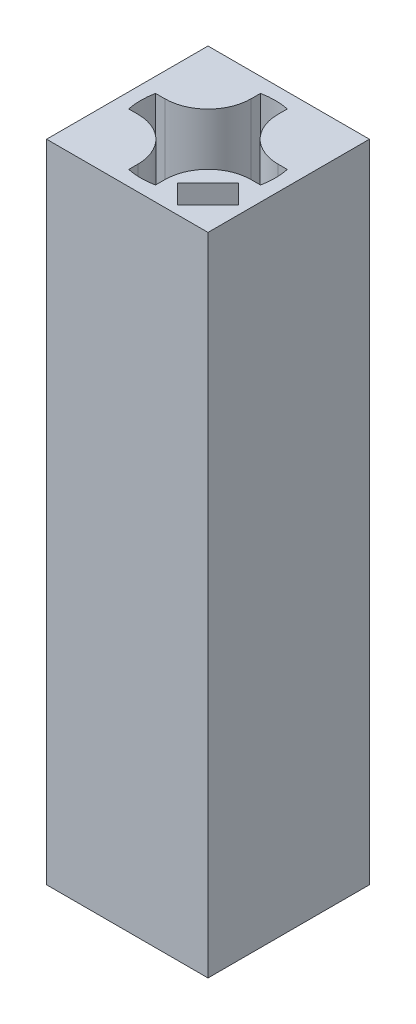
ISO-10303-21;
HEADER;
FILE_DESCRIPTION(('STEP AP214'),'2;1');
FILE_NAME('part.step','',(''),(''),'','','');
FILE_SCHEMA(('AUTOMOTIVE_DESIGN { 1 0 10303 214 1 1 1 1 }'));
ENDSEC;
DATA;
#1=APPLICATION_CONTEXT('core data for automotive mechanical design processes');
#2=APPLICATION_PROTOCOL_DEFINITION('international standard','automotive_design',2000,#1);
#3=PRODUCT_CONTEXT('',#1,'mechanical');
#4=PRODUCT('Part','Part','',(#3));
#5=PRODUCT_RELATED_PRODUCT_CATEGORY('part','',(#4));
#6=PRODUCT_DEFINITION_FORMATION('','',#4);
#7=PRODUCT_DEFINITION_CONTEXT('part definition',#1,'design');
#8=PRODUCT_DEFINITION('design','',#6,#7);
#9=PRODUCT_DEFINITION_SHAPE('','',#8);
#10=(LENGTH_UNIT() NAMED_UNIT(*) SI_UNIT(.MILLI.,.METRE.));
#11=(NAMED_UNIT(*) PLANE_ANGLE_UNIT() SI_UNIT($,.RADIAN.));
#12=(NAMED_UNIT(*) SI_UNIT($,.STERADIAN.) SOLID_ANGLE_UNIT());
#13=UNCERTAINTY_MEASURE_WITH_UNIT(LENGTH_MEASURE(1.E-05),#10,'distance_accuracy_value','');
#14=(GEOMETRIC_REPRESENTATION_CONTEXT(3) GLOBAL_UNCERTAINTY_ASSIGNED_CONTEXT((#13)) GLOBAL_UNIT_ASSIGNED_CONTEXT((#10,
#11,#12)) REPRESENTATION_CONTEXT('',''));
#15=CARTESIAN_POINT('',(0.,0.,0.));
#16=DIRECTION('',(0.,0.,1.));
#17=DIRECTION('',(1.,0.,0.));
#18=AXIS2_PLACEMENT_3D('',#15,#16,#17);
#19=CARTESIAN_POINT('',(0.,120.,0.));
#20=DIRECTION('',(0.,-1.,0.));
#21=DIRECTION('',(0.,0.,-1.));
#22=AXIS2_PLACEMENT_3D('',#19,#20,#21);
#23=PLANE('',#22);
#24=DIRECTION('',(0.707106781186548,0.,-0.707106781186547));
#25=VECTOR('',#24,1.);
#26=CARTESIAN_POINT('',(7.79039269150542,120.,13.4472469409978));
#27=LINE('',#26,#25);
#28=CARTESIAN_POINT('',(7.79039269150542,120.,13.4472469409978));
#29=VERTEX_POINT('',#28);
#30=CARTESIAN_POINT('',(13.4472469409978,120.,7.79039269150543));
#31=VERTEX_POINT('',#30);
#32=EDGE_CURVE('E225',#29,#31,#27,.T.);
#33=ORIENTED_EDGE('',*,*,#32,.F.);
#34=DIRECTION('',(0.707106781186547,0.,0.707106781186548));
#35=VECTOR('',#34,1.);
#36=CARTESIAN_POINT('',(4.25485878557269,120.,9.91171303506506));
#37=LINE('',#36,#35);
#38=CARTESIAN_POINT('',(4.25485878557269,120.,9.91171303506506));
#39=VERTEX_POINT('',#38);
#40=EDGE_CURVE('E50',#39,#29,#37,.T.);
#41=ORIENTED_EDGE('',*,*,#40,.F.);
#42=DIRECTION('',(-0.707106781186547,0.,0.707106781186548));
#43=VECTOR('',#42,1.);
#44=CARTESIAN_POINT('',(4.25485878557269,120.,9.91171303506506));
#45=LINE('',#44,#43);
#46=CARTESIAN_POINT('',(9.91171303506507,120.,4.25485878557268));
#47=VERTEX_POINT('',#46);
#48=EDGE_CURVE('E216',#47,#39,#45,.T.);
#49=ORIENTED_EDGE('',*,*,#48,.F.);
#50=DIRECTION('',(-0.707106781186547,0.,-0.707106781186548));
#51=VECTOR('',#50,1.);
#52=CARTESIAN_POINT('',(9.91171303506507,120.,4.25485878557268));
#53=LINE('',#52,#51);
#54=EDGE_CURVE('E219',#31,#47,#53,.T.);
#55=ORIENTED_EDGE('',*,*,#54,.F.);
#56=EDGE_LOOP('',(#33,#41,#49,#55));
#57=FACE_BOUND('',#56,.T.);
#58=DIRECTION('',(0.,0.,-1.));
#59=VECTOR('',#58,1.);
#60=CARTESIAN_POINT('',(15.,120.,15.));
#61=LINE('',#60,#59);
#62=CARTESIAN_POINT('',(15.,120.,15.));
#63=VERTEX_POINT('',#62);
#64=CARTESIAN_POINT('',(15.,120.,-15.));
#65=VERTEX_POINT('',#64);
#66=EDGE_CURVE('E320',#63,#65,#61,.T.);
#67=ORIENTED_EDGE('',*,*,#66,.T.);
#68=DIRECTION('',(-1.,0.,0.));
#69=VECTOR('',#68,1.);
#70=CARTESIAN_POINT('',(-15.,120.,-15.));
#71=LINE('',#70,#69);
#72=CARTESIAN_POINT('',(-15.,120.,-15.));
#73=VERTEX_POINT('',#72);
#74=EDGE_CURVE('E323',#65,#73,#71,.T.);
#75=ORIENTED_EDGE('',*,*,#74,.T.);
#76=DIRECTION('',(0.,0.,1.));
#77=VECTOR('',#76,1.);
#78=CARTESIAN_POINT('',(-15.,120.,15.));
#79=LINE('',#78,#77);
#80=CARTESIAN_POINT('',(-15.,120.,15.));
#81=VERTEX_POINT('',#80);
#82=EDGE_CURVE('E326',#73,#81,#79,.T.);
#83=ORIENTED_EDGE('',*,*,#82,.T.);
#84=DIRECTION('',(1.,0.,0.));
#85=VECTOR('',#84,1.);
#86=CARTESIAN_POINT('',(-15.,120.,15.));
#87=LINE('',#86,#85);
#88=EDGE_CURVE('E328',#81,#63,#87,.T.);
#89=ORIENTED_EDGE('',*,*,#88,.T.);
#90=EDGE_LOOP('',(#67,#75,#83,#89));
#91=FACE_BOUND('',#90,.T.);
#92=DIRECTION('',(0.,0.,-1.));
#93=VECTOR('',#92,1.);
#94=CARTESIAN_POINT('',(-2.5,120.,0.));
#95=LINE('',#94,#93);
#96=CARTESIAN_POINT('',(-2.5,120.,12.2474487139159));
#97=VERTEX_POINT('',#96);
#98=CARTESIAN_POINT('',(-2.5,120.,10.5));
#99=VERTEX_POINT('',#98);
#100=EDGE_CURVE('E277',#97,#99,#95,.T.);
#101=ORIENTED_EDGE('',*,*,#100,.T.);
#102=CARTESIAN_POINT('',(-10.5,120.,10.5));
#103=DIRECTION('',(0.,-1.,0.));
#104=DIRECTION('',(0.,0.,-1.));
#105=AXIS2_PLACEMENT_3D('',#102,#103,#104);
#106=CIRCLE('',#105,8.);
#107=CARTESIAN_POINT('',(-10.5,120.,2.5));
#108=VERTEX_POINT('',#107);
#109=EDGE_CURVE('E358',#99,#108,#106,.F.);
#110=ORIENTED_EDGE('',*,*,#109,.T.);
#111=DIRECTION('',(1.,0.,0.));
#112=VECTOR('',#111,1.);
#113=CARTESIAN_POINT('',(0.,120.,2.5));
#114=LINE('',#113,#112);
#115=CARTESIAN_POINT('',(-12.2474487139159,120.,2.5));
#116=VERTEX_POINT('',#115);
#117=EDGE_CURVE('E274',#116,#108,#114,.T.);
#118=ORIENTED_EDGE('',*,*,#117,.F.);
#119=CARTESIAN_POINT('',(0.,120.,0.));
#120=DIRECTION('',(0.,1.,0.));
#121=DIRECTION('',(0.,0.,1.));
#122=AXIS2_PLACEMENT_3D('',#119,#120,#121);
#123=CIRCLE('',#122,12.5);
#124=CARTESIAN_POINT('',(-12.2474487139159,120.,-2.5));
#125=VERTEX_POINT('',#124);
#126=EDGE_CURVE('E271',#125,#116,#123,.T.);
#127=ORIENTED_EDGE('',*,*,#126,.F.);
#128=DIRECTION('',(1.,0.,0.));
#129=VECTOR('',#128,1.);
#130=CARTESIAN_POINT('',(0.,120.,-2.5));
#131=LINE('',#130,#129);
#132=CARTESIAN_POINT('',(-10.5,120.,-2.5));
#133=VERTEX_POINT('',#132);
#134=EDGE_CURVE('E231',#125,#133,#131,.T.);
#135=ORIENTED_EDGE('',*,*,#134,.T.);
#136=CARTESIAN_POINT('',(-10.5,120.,-10.5));
#137=DIRECTION('',(0.,-1.,0.));
#138=DIRECTION('',(0.,0.,-1.));
#139=AXIS2_PLACEMENT_3D('',#136,#137,#138);
#140=CIRCLE('',#139,8.);
#141=CARTESIAN_POINT('',(-2.5,120.,-10.5));
#142=VERTEX_POINT('',#141);
#143=EDGE_CURVE('E354',#133,#142,#140,.F.);
#144=ORIENTED_EDGE('',*,*,#143,.T.);
#145=DIRECTION('',(0.,0.,-1.));
#146=VECTOR('',#145,1.);
#147=CARTESIAN_POINT('',(-2.5,120.,0.));
#148=LINE('',#147,#146);
#149=CARTESIAN_POINT('',(-2.5,120.,-12.2474487139159));
#150=VERTEX_POINT('',#149);
#151=EDGE_CURVE('E239',#142,#150,#148,.T.);
#152=ORIENTED_EDGE('',*,*,#151,.T.);
#153=CARTESIAN_POINT('',(0.,120.,0.));
#154=DIRECTION('',(0.,1.,0.));
#155=DIRECTION('',(0.,0.,1.));
#156=AXIS2_PLACEMENT_3D('',#153,#154,#155);
#157=CIRCLE('',#156,12.5);
#158=CARTESIAN_POINT('',(2.5,120.,-12.2474487139159));
#159=VERTEX_POINT('',#158);
#160=EDGE_CURVE('E295',#159,#150,#157,.T.);
#161=ORIENTED_EDGE('',*,*,#160,.F.);
#162=DIRECTION('',(0.,0.,-1.));
#163=VECTOR('',#162,1.);
#164=CARTESIAN_POINT('',(2.5,120.,0.));
#165=LINE('',#164,#163);
#166=CARTESIAN_POINT('',(2.5,120.,-10.5));
#167=VERTEX_POINT('',#166);
#168=EDGE_CURVE('E293',#167,#159,#165,.T.);
#169=ORIENTED_EDGE('',*,*,#168,.F.);
#170=CARTESIAN_POINT('',(10.5,120.,-10.5));
#171=DIRECTION('',(0.,-1.,0.));
#172=DIRECTION('',(0.,0.,-1.));
#173=AXIS2_PLACEMENT_3D('',#170,#171,#172);
#174=CIRCLE('',#173,8.);
#175=CARTESIAN_POINT('',(10.5,120.,-2.5));
#176=VERTEX_POINT('',#175);
#177=EDGE_CURVE('E352',#167,#176,#174,.F.);
#178=ORIENTED_EDGE('',*,*,#177,.T.);
#179=DIRECTION('',(1.,0.,0.));
#180=VECTOR('',#179,1.);
#181=CARTESIAN_POINT('',(0.,120.,-2.5));
#182=LINE('',#181,#180);
#183=CARTESIAN_POINT('',(12.2474487139159,120.,-2.5));
#184=VERTEX_POINT('',#183);
#185=EDGE_CURVE('E291',#176,#184,#182,.T.);
#186=ORIENTED_EDGE('',*,*,#185,.T.);
#187=CARTESIAN_POINT('',(0.,120.,0.));
#188=DIRECTION('',(0.,1.,0.));
#189=DIRECTION('',(0.,0.,1.));
#190=AXIS2_PLACEMENT_3D('',#187,#188,#189);
#191=CIRCLE('',#190,12.5);
#192=CARTESIAN_POINT('',(12.2474487139159,120.,2.5));
#193=VERTEX_POINT('',#192);
#194=EDGE_CURVE('E288',#193,#184,#191,.T.);
#195=ORIENTED_EDGE('',*,*,#194,.F.);
#196=DIRECTION('',(1.,0.,0.));
#197=VECTOR('',#196,1.);
#198=CARTESIAN_POINT('',(0.,120.,2.5));
#199=LINE('',#198,#197);
#200=CARTESIAN_POINT('',(10.5,120.,2.5));
#201=VERTEX_POINT('',#200);
#202=EDGE_CURVE('E286',#201,#193,#199,.T.);
#203=ORIENTED_EDGE('',*,*,#202,.F.);
#204=CARTESIAN_POINT('',(10.5,120.,10.5));
#205=DIRECTION('',(0.,-1.,0.));
#206=DIRECTION('',(0.,0.,-1.));
#207=AXIS2_PLACEMENT_3D('',#204,#205,#206);
#208=CIRCLE('',#207,8.);
#209=CARTESIAN_POINT('',(2.5,120.,10.5));
#210=VERTEX_POINT('',#209);
#211=EDGE_CURVE('E356',#201,#210,#208,.F.);
#212=ORIENTED_EDGE('',*,*,#211,.T.);
#213=DIRECTION('',(0.,0.,-1.));
#214=VECTOR('',#213,1.);
#215=CARTESIAN_POINT('',(2.5,120.,0.));
#216=LINE('',#215,#214);
#217=CARTESIAN_POINT('',(2.5,120.,12.2474487139159));
#218=VERTEX_POINT('',#217);
#219=EDGE_CURVE('E283',#218,#210,#216,.T.);
#220=ORIENTED_EDGE('',*,*,#219,.F.);
#221=CARTESIAN_POINT('',(0.,120.,0.));
#222=DIRECTION('',(0.,1.,0.));
#223=DIRECTION('',(0.,0.,1.));
#224=AXIS2_PLACEMENT_3D('',#221,#222,#223);
#225=CIRCLE('',#224,12.5);
#226=EDGE_CURVE('E280',#97,#218,#225,.T.);
#227=ORIENTED_EDGE('',*,*,#226,.F.);
#228=EDGE_LOOP('',(#101,#110,#118,#127,#135,#144,#152,#161,#169,#178,#186,#195,#203,#212,#220,#227));
#229=FACE_BOUND('',#228,.T.);
#230=ADVANCED_FACE('F35',(#57,#91,#229),#23,.F.);
#231=CARTESIAN_POINT('',(15.,120.,15.));
#232=DIRECTION('',(-1.,0.,0.));
#233=DIRECTION('',(0.,0.,1.));
#234=AXIS2_PLACEMENT_3D('',#231,#232,#233);
#235=PLANE('',#234);
#236=DIRECTION('',(0.,0.,-1.));
#237=VECTOR('',#236,1.);
#238=CARTESIAN_POINT('',(15.,0.,15.));
#239=LINE('',#238,#237);
#240=CARTESIAN_POINT('',(15.,0.,15.));
#241=VERTEX_POINT('',#240);
#242=CARTESIAN_POINT('',(15.,0.,-15.));
#243=VERTEX_POINT('',#242);
#244=EDGE_CURVE('E302',#241,#243,#239,.T.);
#245=ORIENTED_EDGE('',*,*,#244,.T.);
#246=DIRECTION('',(0.,-1.,0.));
#247=VECTOR('',#246,1.);
#248=CARTESIAN_POINT('',(15.,120.,-15.));
#249=LINE('',#248,#247);
#250=EDGE_CURVE('E346',#65,#243,#249,.T.);
#251=ORIENTED_EDGE('',*,*,#250,.F.);
#252=ORIENTED_EDGE('',*,*,#66,.F.);
#253=DIRECTION('',(0.,-1.,0.));
#254=VECTOR('',#253,1.);
#255=CARTESIAN_POINT('',(15.,120.,15.));
#256=LINE('',#255,#254);
#257=EDGE_CURVE('E330',#63,#241,#256,.T.);
#258=ORIENTED_EDGE('',*,*,#257,.T.);
#259=EDGE_LOOP('',(#245,#251,#252,#258));
#260=FACE_BOUND('',#259,.T.);
#261=ADVANCED_FACE('F458',(#260),#235,.F.);
#262=CARTESIAN_POINT('',(-15.,120.,-15.));
#263=DIRECTION('',(0.,0.,1.));
#264=DIRECTION('',(1.,0.,0.));
#265=AXIS2_PLACEMENT_3D('',#262,#263,#264);
#266=PLANE('',#265);
#267=DIRECTION('',(-1.,0.,0.));
#268=VECTOR('',#267,1.);
#269=CARTESIAN_POINT('',(-15.,0.,-15.));
#270=LINE('',#269,#268);
#271=CARTESIAN_POINT('',(-15.,0.,-15.));
#272=VERTEX_POINT('',#271);
#273=EDGE_CURVE('E333',#243,#272,#270,.T.);
#274=ORIENTED_EDGE('',*,*,#273,.T.);
#275=DIRECTION('',(0.,-1.,0.));
#276=VECTOR('',#275,1.);
#277=CARTESIAN_POINT('',(-15.,120.,-15.));
#278=LINE('',#277,#276);
#279=EDGE_CURVE('E343',#73,#272,#278,.T.);
#280=ORIENTED_EDGE('',*,*,#279,.F.);
#281=ORIENTED_EDGE('',*,*,#74,.F.);
#282=ORIENTED_EDGE('',*,*,#250,.T.);
#283=EDGE_LOOP('',(#274,#280,#281,#282));
#284=FACE_BOUND('',#283,.T.);
#285=ADVANCED_FACE('F464',(#284),#266,.F.);
#286=CARTESIAN_POINT('',(-15.,120.,15.));
#287=DIRECTION('',(1.,0.,0.));
#288=DIRECTION('',(0.,0.,-1.));
#289=AXIS2_PLACEMENT_3D('',#286,#287,#288);
#290=PLANE('',#289);
#291=DIRECTION('',(0.,0.,1.));
#292=VECTOR('',#291,1.);
#293=CARTESIAN_POINT('',(-15.,0.,15.));
#294=LINE('',#293,#292);
#295=CARTESIAN_POINT('',(-15.,0.,15.));
#296=VERTEX_POINT('',#295);
#297=EDGE_CURVE('E335',#272,#296,#294,.T.);
#298=ORIENTED_EDGE('',*,*,#297,.T.);
#299=DIRECTION('',(0.,-1.,0.));
#300=VECTOR('',#299,1.);
#301=CARTESIAN_POINT('',(-15.,120.,15.));
#302=LINE('',#301,#300);
#303=EDGE_CURVE('E340',#81,#296,#302,.T.);
#304=ORIENTED_EDGE('',*,*,#303,.F.);
#305=ORIENTED_EDGE('',*,*,#82,.F.);
#306=ORIENTED_EDGE('',*,*,#279,.T.);
#307=EDGE_LOOP('',(#298,#304,#305,#306));
#308=FACE_BOUND('',#307,.T.);
#309=ADVANCED_FACE('F476',(#308),#290,.F.);
#310=CARTESIAN_POINT('',(-15.,120.,15.));
#311=DIRECTION('',(0.,0.,-1.));
#312=DIRECTION('',(-1.,0.,0.));
#313=AXIS2_PLACEMENT_3D('',#310,#311,#312);
#314=PLANE('',#313);
#315=DIRECTION('',(1.,0.,0.));
#316=VECTOR('',#315,1.);
#317=CARTESIAN_POINT('',(-15.,0.,15.));
#318=LINE('',#317,#316);
#319=EDGE_CURVE('E324',#296,#241,#318,.T.);
#320=ORIENTED_EDGE('',*,*,#319,.T.);
#321=ORIENTED_EDGE('',*,*,#257,.F.);
#322=ORIENTED_EDGE('',*,*,#88,.F.);
#323=ORIENTED_EDGE('',*,*,#303,.T.);
#324=EDGE_LOOP('',(#320,#321,#322,#323));
#325=FACE_BOUND('',#324,.T.);
#326=ADVANCED_FACE('F472',(#325),#314,.F.);
#327=CARTESIAN_POINT('',(0.,0.,0.));
#328=DIRECTION('',(0.,-1.,0.));
#329=DIRECTION('',(0.,0.,-1.));
#330=AXIS2_PLACEMENT_3D('',#327,#328,#329);
#331=PLANE('',#330);
#332=ORIENTED_EDGE('',*,*,#244,.F.);
#333=ORIENTED_EDGE('',*,*,#319,.F.);
#334=ORIENTED_EDGE('',*,*,#297,.F.);
#335=ORIENTED_EDGE('',*,*,#273,.F.);
#336=EDGE_LOOP('',(#332,#333,#334,#335));
#337=FACE_BOUND('',#336,.T.);
#338=ADVANCED_FACE('F469',(#337),#331,.T.);
#339=CARTESIAN_POINT('',(0.,20.,-2.5));
#340=DIRECTION('',(0.,0.,1.));
#341=DIRECTION('',(1.,0.,0.));
#342=AXIS2_PLACEMENT_3D('',#339,#340,#341);
#343=PLANE('',#342);
#344=DIRECTION('',(1.,0.,0.));
#345=VECTOR('',#344,1.);
#346=CARTESIAN_POINT('',(0.,20.,-2.5));
#347=LINE('',#346,#345);
#348=CARTESIAN_POINT('',(-12.2474487139159,20.,-2.5));
#349=VERTEX_POINT('',#348);
#350=CARTESIAN_POINT('',(-10.5,20.,-2.5));
#351=VERTEX_POINT('',#350);
#352=EDGE_CURVE('E235',#349,#351,#347,.T.);
#353=ORIENTED_EDGE('',*,*,#352,.T.);
#354=DIRECTION('',(0.,1.,0.));
#355=VECTOR('',#354,1.);
#356=CARTESIAN_POINT('',(-10.5,20.,-2.5));
#357=LINE('',#356,#355);
#358=EDGE_CURVE('E367',#351,#133,#357,.T.);
#359=ORIENTED_EDGE('',*,*,#358,.T.);
#360=ORIENTED_EDGE('',*,*,#134,.F.);
#361=DIRECTION('',(0.,1.,0.));
#362=VECTOR('',#361,1.);
#363=CARTESIAN_POINT('',(-12.2474487139159,20.,-2.5));
#364=LINE('',#363,#362);
#365=EDGE_CURVE('E268',#349,#125,#364,.T.);
#366=ORIENTED_EDGE('',*,*,#365,.F.);
#367=EDGE_LOOP('',(#353,#359,#360,#366));
#368=FACE_BOUND('',#367,.T.);
#369=ADVANCED_FACE('F389',(#368),#343,.T.);
#370=CARTESIAN_POINT('',(-2.5,20.,0.));
#371=DIRECTION('',(1.,0.,0.));
#372=DIRECTION('',(0.,0.,-1.));
#373=AXIS2_PLACEMENT_3D('',#370,#371,#372);
#374=PLANE('',#373);
#375=ORIENTED_EDGE('',*,*,#151,.F.);
#376=DIRECTION('',(0.,1.,0.));
#377=VECTOR('',#376,1.);
#378=CARTESIAN_POINT('',(-2.5,20.,-10.5));
#379=LINE('',#378,#377);
#380=CARTESIAN_POINT('',(-2.5,20.,-10.5));
#381=VERTEX_POINT('',#380);
#382=EDGE_CURVE('E370',#142,#381,#379,.F.);
#383=ORIENTED_EDGE('',*,*,#382,.T.);
#384=DIRECTION('',(0.,0.,-1.));
#385=VECTOR('',#384,1.);
#386=CARTESIAN_POINT('',(-2.5,20.,0.));
#387=LINE('',#386,#385);
#388=CARTESIAN_POINT('',(-2.5,20.,-12.2474487139159));
#389=VERTEX_POINT('',#388);
#390=EDGE_CURVE('E266',#381,#389,#387,.T.);
#391=ORIENTED_EDGE('',*,*,#390,.T.);
#392=DIRECTION('',(0.,1.,0.));
#393=VECTOR('',#392,1.);
#394=CARTESIAN_POINT('',(-2.5,20.,-12.2474487139159));
#395=LINE('',#394,#393);
#396=EDGE_CURVE('E299',#389,#150,#395,.T.);
#397=ORIENTED_EDGE('',*,*,#396,.T.);
#398=EDGE_LOOP('',(#375,#383,#391,#397));
#399=FACE_BOUND('',#398,.T.);
#400=ADVANCED_FACE('F396',(#399),#374,.T.);
#401=CARTESIAN_POINT('',(0.,20.,0.));
#402=DIRECTION('',(0.,1.,0.));
#403=DIRECTION('',(0.,0.,1.));
#404=AXIS2_PLACEMENT_3D('',#401,#402,#403);
#405=CYLINDRICAL_SURFACE('',#404,12.5);
#406=ORIENTED_EDGE('',*,*,#160,.T.);
#407=ORIENTED_EDGE('',*,*,#396,.F.);
#408=CARTESIAN_POINT('',(0.,20.,0.));
#409=DIRECTION('',(0.,1.,0.));
#410=DIRECTION('',(0.,0.,1.));
#411=AXIS2_PLACEMENT_3D('',#408,#409,#410);
#412=CIRCLE('',#411,12.5);
#413=CARTESIAN_POINT('',(2.5,20.,-12.2474487139159));
#414=VERTEX_POINT('',#413);
#415=EDGE_CURVE('E263',#414,#389,#412,.T.);
#416=ORIENTED_EDGE('',*,*,#415,.F.);
#417=DIRECTION('',(0.,1.,0.));
#418=VECTOR('',#417,1.);
#419=CARTESIAN_POINT('',(2.5,20.,-12.2474487139159));
#420=LINE('',#419,#418);
#421=EDGE_CURVE('E303',#414,#159,#420,.T.);
#422=ORIENTED_EDGE('',*,*,#421,.T.);
#423=EDGE_LOOP('',(#406,#407,#416,#422));
#424=FACE_BOUND('',#423,.T.);
#425=ADVANCED_FACE('F400',(#424),#405,.F.);
#426=CARTESIAN_POINT('',(2.5,20.,0.));
#427=DIRECTION('',(1.,0.,0.));
#428=DIRECTION('',(0.,0.,-1.));
#429=AXIS2_PLACEMENT_3D('',#426,#427,#428);
#430=PLANE('',#429);
#431=DIRECTION('',(0.,0.,-1.));
#432=VECTOR('',#431,1.);
#433=CARTESIAN_POINT('',(2.5,20.,0.));
#434=LINE('',#433,#432);
#435=CARTESIAN_POINT('',(2.5,20.,-10.5));
#436=VERTEX_POINT('',#435);
#437=EDGE_CURVE('E261',#436,#414,#434,.T.);
#438=ORIENTED_EDGE('',*,*,#437,.F.);
#439=DIRECTION('',(0.,1.,0.));
#440=VECTOR('',#439,1.);
#441=CARTESIAN_POINT('',(2.5,120.,-10.5));
#442=LINE('',#441,#440);
#443=EDGE_CURVE('E372',#436,#167,#442,.T.);
#444=ORIENTED_EDGE('',*,*,#443,.T.);
#445=ORIENTED_EDGE('',*,*,#168,.T.);
#446=ORIENTED_EDGE('',*,*,#421,.F.);
#447=EDGE_LOOP('',(#438,#444,#445,#446));
#448=FACE_BOUND('',#447,.T.);
#449=ADVANCED_FACE('F405',(#448),#430,.F.);
#450=CARTESIAN_POINT('',(0.,20.,-2.5));
#451=DIRECTION('',(0.,0.,1.));
#452=DIRECTION('',(1.,0.,0.));
#453=AXIS2_PLACEMENT_3D('',#450,#451,#452);
#454=PLANE('',#453);
#455=ORIENTED_EDGE('',*,*,#185,.F.);
#456=DIRECTION('',(0.,1.,0.));
#457=VECTOR('',#456,1.);
#458=CARTESIAN_POINT('',(10.5,20.,-2.5));
#459=LINE('',#458,#457);
#460=CARTESIAN_POINT('',(10.5,20.,-2.5));
#461=VERTEX_POINT('',#460);
#462=EDGE_CURVE('E58',#176,#461,#459,.F.);
#463=ORIENTED_EDGE('',*,*,#462,.T.);
#464=DIRECTION('',(1.,0.,0.));
#465=VECTOR('',#464,1.);
#466=CARTESIAN_POINT('',(0.,20.,-2.5));
#467=LINE('',#466,#465);
#468=CARTESIAN_POINT('',(12.2474487139159,20.,-2.5));
#469=VERTEX_POINT('',#468);
#470=EDGE_CURVE('E259',#461,#469,#467,.T.);
#471=ORIENTED_EDGE('',*,*,#470,.T.);
#472=DIRECTION('',(0.,1.,0.));
#473=VECTOR('',#472,1.);
#474=CARTESIAN_POINT('',(12.2474487139159,20.,-2.5));
#475=LINE('',#474,#473);
#476=EDGE_CURVE('E306',#469,#184,#475,.T.);
#477=ORIENTED_EDGE('',*,*,#476,.T.);
#478=EDGE_LOOP('',(#455,#463,#471,#477));
#479=FACE_BOUND('',#478,.T.);
#480=ADVANCED_FACE('F411',(#479),#454,.T.);
#481=CARTESIAN_POINT('',(0.,20.,0.));
#482=DIRECTION('',(0.,1.,0.));
#483=DIRECTION('',(0.,0.,1.));
#484=AXIS2_PLACEMENT_3D('',#481,#482,#483);
#485=CYLINDRICAL_SURFACE('',#484,12.5);
#486=ORIENTED_EDGE('',*,*,#194,.T.);
#487=ORIENTED_EDGE('',*,*,#476,.F.);
#488=CARTESIAN_POINT('',(0.,20.,0.));
#489=DIRECTION('',(0.,1.,0.));
#490=DIRECTION('',(0.,0.,1.));
#491=AXIS2_PLACEMENT_3D('',#488,#489,#490);
#492=CIRCLE('',#491,12.5);
#493=CARTESIAN_POINT('',(12.2474487139159,20.,2.5));
#494=VERTEX_POINT('',#493);
#495=EDGE_CURVE('E256',#494,#469,#492,.T.);
#496=ORIENTED_EDGE('',*,*,#495,.F.);
#497=DIRECTION('',(0.,1.,0.));
#498=VECTOR('',#497,1.);
#499=CARTESIAN_POINT('',(12.2474487139159,20.,2.5));
#500=LINE('',#499,#498);
#501=EDGE_CURVE('E309',#494,#193,#500,.T.);
#502=ORIENTED_EDGE('',*,*,#501,.T.);
#503=EDGE_LOOP('',(#486,#487,#496,#502));
#504=FACE_BOUND('',#503,.T.);
#505=ADVANCED_FACE('F413',(#504),#485,.F.);
#506=CARTESIAN_POINT('',(0.,20.,2.5));
#507=DIRECTION('',(0.,0.,1.));
#508=DIRECTION('',(1.,0.,0.));
#509=AXIS2_PLACEMENT_3D('',#506,#507,#508);
#510=PLANE('',#509);
#511=DIRECTION('',(1.,0.,0.));
#512=VECTOR('',#511,1.);
#513=CARTESIAN_POINT('',(0.,20.,2.5));
#514=LINE('',#513,#512);
#515=CARTESIAN_POINT('',(10.5,20.,2.5));
#516=VERTEX_POINT('',#515);
#517=EDGE_CURVE('E254',#516,#494,#514,.T.);
#518=ORIENTED_EDGE('',*,*,#517,.F.);
#519=DIRECTION('',(0.,1.,0.));
#520=VECTOR('',#519,1.);
#521=CARTESIAN_POINT('',(10.5,20.,2.5));
#522=LINE('',#521,#520);
#523=EDGE_CURVE('E362',#516,#201,#522,.T.);
#524=ORIENTED_EDGE('',*,*,#523,.T.);
#525=ORIENTED_EDGE('',*,*,#202,.T.);
#526=ORIENTED_EDGE('',*,*,#501,.F.);
#527=EDGE_LOOP('',(#518,#524,#525,#526));
#528=FACE_BOUND('',#527,.T.);
#529=ADVANCED_FACE('F420',(#528),#510,.F.);
#530=CARTESIAN_POINT('',(2.5,20.,0.));
#531=DIRECTION('',(1.,0.,0.));
#532=DIRECTION('',(0.,0.,-1.));
#533=AXIS2_PLACEMENT_3D('',#530,#531,#532);
#534=PLANE('',#533);
#535=ORIENTED_EDGE('',*,*,#219,.T.);
#536=DIRECTION('',(0.,1.,0.));
#537=VECTOR('',#536,1.);
#538=CARTESIAN_POINT('',(2.5,20.,10.5));
#539=LINE('',#538,#537);
#540=CARTESIAN_POINT('',(2.5,20.,10.5));
#541=VERTEX_POINT('',#540);
#542=EDGE_CURVE('E365',#210,#541,#539,.F.);
#543=ORIENTED_EDGE('',*,*,#542,.T.);
#544=DIRECTION('',(0.,0.,-1.));
#545=VECTOR('',#544,1.);
#546=CARTESIAN_POINT('',(2.5,20.,0.));
#547=LINE('',#546,#545);
#548=CARTESIAN_POINT('',(2.5,20.,12.2474487139159));
#549=VERTEX_POINT('',#548);
#550=EDGE_CURVE('E251',#549,#541,#547,.T.);
#551=ORIENTED_EDGE('',*,*,#550,.F.);
#552=DIRECTION('',(0.,1.,0.));
#553=VECTOR('',#552,1.);
#554=CARTESIAN_POINT('',(2.5,20.,12.2474487139159));
#555=LINE('',#554,#553);
#556=EDGE_CURVE('E312',#549,#218,#555,.T.);
#557=ORIENTED_EDGE('',*,*,#556,.T.);
#558=EDGE_LOOP('',(#535,#543,#551,#557));
#559=FACE_BOUND('',#558,.T.);
#560=ADVANCED_FACE('F428',(#559),#534,.F.);
#561=CARTESIAN_POINT('',(0.,20.,0.));
#562=DIRECTION('',(0.,1.,0.));
#563=DIRECTION('',(0.,0.,1.));
#564=AXIS2_PLACEMENT_3D('',#561,#562,#563);
#565=CYLINDRICAL_SURFACE('',#564,12.5);
#566=ORIENTED_EDGE('',*,*,#226,.T.);
#567=ORIENTED_EDGE('',*,*,#556,.F.);
#568=CARTESIAN_POINT('',(0.,20.,0.));
#569=DIRECTION('',(0.,1.,0.));
#570=DIRECTION('',(0.,0.,1.));
#571=AXIS2_PLACEMENT_3D('',#568,#569,#570);
#572=CIRCLE('',#571,12.5);
#573=CARTESIAN_POINT('',(-2.5,20.,12.2474487139159));
#574=VERTEX_POINT('',#573);
#575=EDGE_CURVE('E248',#574,#549,#572,.T.);
#576=ORIENTED_EDGE('',*,*,#575,.F.);
#577=DIRECTION('',(0.,1.,0.));
#578=VECTOR('',#577,1.);
#579=CARTESIAN_POINT('',(-2.5,20.,12.2474487139159));
#580=LINE('',#579,#578);
#581=EDGE_CURVE('E314',#574,#97,#580,.T.);
#582=ORIENTED_EDGE('',*,*,#581,.T.);
#583=EDGE_LOOP('',(#566,#567,#576,#582));
#584=FACE_BOUND('',#583,.T.);
#585=ADVANCED_FACE('F432',(#584),#565,.F.);
#586=CARTESIAN_POINT('',(-2.5,20.,0.));
#587=DIRECTION('',(1.,0.,0.));
#588=DIRECTION('',(0.,0.,-1.));
#589=AXIS2_PLACEMENT_3D('',#586,#587,#588);
#590=PLANE('',#589);
#591=DIRECTION('',(0.,0.,-1.));
#592=VECTOR('',#591,1.);
#593=CARTESIAN_POINT('',(-2.5,20.,0.));
#594=LINE('',#593,#592);
#595=CARTESIAN_POINT('',(-2.5,20.,10.5));
#596=VERTEX_POINT('',#595);
#597=EDGE_CURVE('E245',#574,#596,#594,.T.);
#598=ORIENTED_EDGE('',*,*,#597,.T.);
#599=DIRECTION('',(0.,1.,0.));
#600=VECTOR('',#599,1.);
#601=CARTESIAN_POINT('',(-2.5,120.,10.5));
#602=LINE('',#601,#600);
#603=EDGE_CURVE('E349',#596,#99,#602,.T.);
#604=ORIENTED_EDGE('',*,*,#603,.T.);
#605=ORIENTED_EDGE('',*,*,#100,.F.);
#606=ORIENTED_EDGE('',*,*,#581,.F.);
#607=EDGE_LOOP('',(#598,#604,#605,#606));
#608=FACE_BOUND('',#607,.T.);
#609=ADVANCED_FACE('F437',(#608),#590,.T.);
#610=CARTESIAN_POINT('',(0.,20.,2.5));
#611=DIRECTION('',(0.,0.,1.));
#612=DIRECTION('',(1.,0.,0.));
#613=AXIS2_PLACEMENT_3D('',#610,#611,#612);
#614=PLANE('',#613);
#615=ORIENTED_EDGE('',*,*,#117,.T.);
#616=DIRECTION('',(0.,1.,0.));
#617=VECTOR('',#616,1.);
#618=CARTESIAN_POINT('',(-10.5,20.,2.5));
#619=LINE('',#618,#617);
#620=CARTESIAN_POINT('',(-10.5,20.,2.5));
#621=VERTEX_POINT('',#620);
#622=EDGE_CURVE('E360',#108,#621,#619,.F.);
#623=ORIENTED_EDGE('',*,*,#622,.T.);
#624=DIRECTION('',(1.,0.,0.));
#625=VECTOR('',#624,1.);
#626=CARTESIAN_POINT('',(0.,20.,2.5));
#627=LINE('',#626,#625);
#628=CARTESIAN_POINT('',(-12.2474487139159,20.,2.5));
#629=VERTEX_POINT('',#628);
#630=EDGE_CURVE('E242',#629,#621,#627,.T.);
#631=ORIENTED_EDGE('',*,*,#630,.F.);
#632=DIRECTION('',(0.,1.,0.));
#633=VECTOR('',#632,1.);
#634=CARTESIAN_POINT('',(-12.2474487139159,20.,2.5));
#635=LINE('',#634,#633);
#636=EDGE_CURVE('E316',#629,#116,#635,.T.);
#637=ORIENTED_EDGE('',*,*,#636,.T.);
#638=EDGE_LOOP('',(#615,#623,#631,#637));
#639=FACE_BOUND('',#638,.T.);
#640=ADVANCED_FACE('F445',(#639),#614,.F.);
#641=CARTESIAN_POINT('',(0.,20.,0.));
#642=DIRECTION('',(0.,1.,0.));
#643=DIRECTION('',(0.,0.,1.));
#644=AXIS2_PLACEMENT_3D('',#641,#642,#643);
#645=CYLINDRICAL_SURFACE('',#644,12.5);
#646=ORIENTED_EDGE('',*,*,#126,.T.);
#647=ORIENTED_EDGE('',*,*,#636,.F.);
#648=CARTESIAN_POINT('',(0.,20.,0.));
#649=DIRECTION('',(0.,1.,0.));
#650=DIRECTION('',(0.,0.,1.));
#651=AXIS2_PLACEMENT_3D('',#648,#649,#650);
#652=CIRCLE('',#651,12.5);
#653=EDGE_CURVE('E238',#349,#629,#652,.T.);
#654=ORIENTED_EDGE('',*,*,#653,.F.);
#655=ORIENTED_EDGE('',*,*,#365,.T.);
#656=EDGE_LOOP('',(#646,#647,#654,#655));
#657=FACE_BOUND('',#656,.T.);
#658=ADVANCED_FACE('F447',(#657),#645,.F.);
#659=CARTESIAN_POINT('',(0.,20.,0.));
#660=DIRECTION('',(0.,1.,0.));
#661=DIRECTION('',(0.,0.,1.));
#662=AXIS2_PLACEMENT_3D('',#659,#660,#661);
#663=PLANE('',#662);
#664=ORIENTED_EDGE('',*,*,#352,.F.);
#665=ORIENTED_EDGE('',*,*,#653,.T.);
#666=ORIENTED_EDGE('',*,*,#630,.T.);
#667=CARTESIAN_POINT('',(-10.5,20.,10.5));
#668=DIRECTION('',(0.,1.,0.));
#669=DIRECTION('',(0.,0.,1.));
#670=AXIS2_PLACEMENT_3D('',#667,#668,#669);
#671=CIRCLE('',#670,8.);
#672=EDGE_CURVE('E376',#621,#596,#671,.F.);
#673=ORIENTED_EDGE('',*,*,#672,.T.);
#674=ORIENTED_EDGE('',*,*,#597,.F.);
#675=ORIENTED_EDGE('',*,*,#575,.T.);
#676=ORIENTED_EDGE('',*,*,#550,.T.);
#677=CARTESIAN_POINT('',(10.5,20.,10.5));
#678=DIRECTION('',(0.,1.,0.));
#679=DIRECTION('',(0.,0.,1.));
#680=AXIS2_PLACEMENT_3D('',#677,#678,#679);
#681=CIRCLE('',#680,8.);
#682=EDGE_CURVE('E378',#541,#516,#681,.F.);
#683=ORIENTED_EDGE('',*,*,#682,.T.);
#684=ORIENTED_EDGE('',*,*,#517,.T.);
#685=ORIENTED_EDGE('',*,*,#495,.T.);
#686=ORIENTED_EDGE('',*,*,#470,.F.);
#687=CARTESIAN_POINT('',(10.5,20.,-10.5));
#688=DIRECTION('',(0.,1.,0.));
#689=DIRECTION('',(0.,0.,1.));
#690=AXIS2_PLACEMENT_3D('',#687,#688,#689);
#691=CIRCLE('',#690,8.);
#692=EDGE_CURVE('E11',#461,#436,#691,.F.);
#693=ORIENTED_EDGE('',*,*,#692,.T.);
#694=ORIENTED_EDGE('',*,*,#437,.T.);
#695=ORIENTED_EDGE('',*,*,#415,.T.);
#696=ORIENTED_EDGE('',*,*,#390,.F.);
#697=CARTESIAN_POINT('',(-10.5,20.,-10.5));
#698=DIRECTION('',(0.,1.,0.));
#699=DIRECTION('',(0.,0.,1.));
#700=AXIS2_PLACEMENT_3D('',#697,#698,#699);
#701=CIRCLE('',#700,8.);
#702=EDGE_CURVE('E43',#381,#351,#701,.F.);
#703=ORIENTED_EDGE('',*,*,#702,.T.);
#704=EDGE_LOOP('',(#664,#665,#666,#673,#674,#675,#676,#683,#684,#685,#686,#693,#694,#695,#696,#703));
#705=FACE_BOUND('',#704,.T.);
#706=ADVANCED_FACE('F383',(#705),#663,.T.);
#707=CARTESIAN_POINT('',(-10.5,20.,10.5));
#708=DIRECTION('',(0.,-1.,0.));
#709=DIRECTION('',(0.,0.,-1.));
#710=AXIS2_PLACEMENT_3D('',#707,#708,#709);
#711=CYLINDRICAL_SURFACE('',#710,8.);
#712=ORIENTED_EDGE('',*,*,#672,.F.);
#713=ORIENTED_EDGE('',*,*,#622,.F.);
#714=ORIENTED_EDGE('',*,*,#109,.F.);
#715=ORIENTED_EDGE('',*,*,#603,.F.);
#716=EDGE_LOOP('',(#712,#713,#714,#715));
#717=FACE_BOUND('',#716,.T.);
#718=ADVANCED_FACE('F441',(#717),#711,.T.);
#719=CARTESIAN_POINT('',(10.5,20.,10.5));
#720=DIRECTION('',(0.,1.,0.));
#721=DIRECTION('',(0.,0.,1.));
#722=AXIS2_PLACEMENT_3D('',#719,#720,#721);
#723=CYLINDRICAL_SURFACE('',#722,8.);
#724=ORIENTED_EDGE('',*,*,#682,.F.);
#725=ORIENTED_EDGE('',*,*,#542,.F.);
#726=ORIENTED_EDGE('',*,*,#211,.F.);
#727=ORIENTED_EDGE('',*,*,#523,.F.);
#728=EDGE_LOOP('',(#724,#725,#726,#727));
#729=FACE_BOUND('',#728,.T.);
#730=ADVANCED_FACE('F424',(#729),#723,.T.);
#731=CARTESIAN_POINT('',(-10.5,20.,-10.5));
#732=DIRECTION('',(0.,1.,0.));
#733=DIRECTION('',(0.,0.,1.));
#734=AXIS2_PLACEMENT_3D('',#731,#732,#733);
#735=CYLINDRICAL_SURFACE('',#734,8.);
#736=ORIENTED_EDGE('',*,*,#702,.F.);
#737=ORIENTED_EDGE('',*,*,#382,.F.);
#738=ORIENTED_EDGE('',*,*,#143,.F.);
#739=ORIENTED_EDGE('',*,*,#358,.F.);
#740=EDGE_LOOP('',(#736,#737,#738,#739));
#741=FACE_BOUND('',#740,.T.);
#742=ADVANCED_FACE('F390',(#741),#735,.T.);
#743=CARTESIAN_POINT('',(10.5,20.,-10.5));
#744=DIRECTION('',(0.,-1.,0.));
#745=DIRECTION('',(0.,0.,-1.));
#746=AXIS2_PLACEMENT_3D('',#743,#744,#745);
#747=CYLINDRICAL_SURFACE('',#746,8.);
#748=ORIENTED_EDGE('',*,*,#692,.F.);
#749=ORIENTED_EDGE('',*,*,#462,.F.);
#750=ORIENTED_EDGE('',*,*,#177,.F.);
#751=ORIENTED_EDGE('',*,*,#443,.F.);
#752=EDGE_LOOP('',(#748,#749,#750,#751));
#753=FACE_BOUND('',#752,.T.);
#754=ADVANCED_FACE('F37',(#753),#747,.T.);
#755=CARTESIAN_POINT('',(4.25485878557269,110.,9.91171303506506));
#756=DIRECTION('',(-0.707106781186548,0.,0.707106781186547));
#757=DIRECTION('',(0.707106781186547,0.,0.707106781186548));
#758=AXIS2_PLACEMENT_3D('',#755,#756,#757);
#759=PLANE('',#758);
#760=ORIENTED_EDGE('',*,*,#40,.T.);
#761=DIRECTION('',(0.,1.,0.));
#762=VECTOR('',#761,1.);
#763=CARTESIAN_POINT('',(7.79039269150542,110.,13.4472469409978));
#764=LINE('',#763,#762);
#765=CARTESIAN_POINT('',(7.79039269150542,110.,13.4472469409978));
#766=VERTEX_POINT('',#765);
#767=EDGE_CURVE('E194',#766,#29,#764,.T.);
#768=ORIENTED_EDGE('',*,*,#767,.F.);
#769=DIRECTION('',(0.707106781186547,0.,0.707106781186548));
#770=VECTOR('',#769,1.);
#771=CARTESIAN_POINT('',(4.25485878557269,110.,9.91171303506506));
#772=LINE('',#771,#770);
#773=CARTESIAN_POINT('',(4.25485878557269,110.,9.91171303506506));
#774=VERTEX_POINT('',#773);
#775=EDGE_CURVE('E198',#774,#766,#772,.T.);
#776=ORIENTED_EDGE('',*,*,#775,.F.);
#777=DIRECTION('',(0.,1.,0.));
#778=VECTOR('',#777,1.);
#779=CARTESIAN_POINT('',(4.25485878557269,110.,9.91171303506506));
#780=LINE('',#779,#778);
#781=EDGE_CURVE('E229',#774,#39,#780,.T.);
#782=ORIENTED_EDGE('',*,*,#781,.T.);
#783=EDGE_LOOP('',(#760,#768,#776,#782));
#784=FACE_BOUND('',#783,.T.);
#785=ADVANCED_FACE('F196',(#784),#759,.F.);
#786=CARTESIAN_POINT('',(4.25485878557269,110.,9.91171303506506));
#787=DIRECTION('',(-0.707106781186548,0.,-0.707106781186547));
#788=DIRECTION('',(-0.707106781186547,0.,0.707106781186548));
#789=AXIS2_PLACEMENT_3D('',#786,#787,#788);
#790=PLANE('',#789);
#791=ORIENTED_EDGE('',*,*,#48,.T.);
#792=ORIENTED_EDGE('',*,*,#781,.F.);
#793=DIRECTION('',(-0.707106781186547,0.,0.707106781186548));
#794=VECTOR('',#793,1.);
#795=CARTESIAN_POINT('',(4.25485878557269,110.,9.91171303506506));
#796=LINE('',#795,#794);
#797=CARTESIAN_POINT('',(9.91171303506507,110.,4.25485878557268));
#798=VERTEX_POINT('',#797);
#799=EDGE_CURVE('E204',#798,#774,#796,.T.);
#800=ORIENTED_EDGE('',*,*,#799,.F.);
#801=DIRECTION('',(0.,1.,0.));
#802=VECTOR('',#801,1.);
#803=CARTESIAN_POINT('',(9.91171303506507,110.,4.25485878557268));
#804=LINE('',#803,#802);
#805=EDGE_CURVE('E232',#798,#47,#804,.T.);
#806=ORIENTED_EDGE('',*,*,#805,.T.);
#807=EDGE_LOOP('',(#791,#792,#800,#806));
#808=FACE_BOUND('',#807,.T.);
#809=ADVANCED_FACE('F494',(#808),#790,.F.);
#810=CARTESIAN_POINT('',(9.91171303506507,110.,4.25485878557268));
#811=DIRECTION('',(0.707106781186548,0.,-0.707106781186547));
#812=DIRECTION('',(-0.707106781186547,0.,-0.707106781186548));
#813=AXIS2_PLACEMENT_3D('',#810,#811,#812);
#814=PLANE('',#813);
#815=ORIENTED_EDGE('',*,*,#54,.T.);
#816=ORIENTED_EDGE('',*,*,#805,.F.);
#817=DIRECTION('',(-0.707106781186547,0.,-0.707106781186548));
#818=VECTOR('',#817,1.);
#819=CARTESIAN_POINT('',(9.91171303506507,110.,4.25485878557268));
#820=LINE('',#819,#818);
#821=CARTESIAN_POINT('',(13.4472469409978,110.,7.79039269150543));
#822=VERTEX_POINT('',#821);
#823=EDGE_CURVE('E212',#822,#798,#820,.T.);
#824=ORIENTED_EDGE('',*,*,#823,.F.);
#825=DIRECTION('',(0.,1.,0.));
#826=VECTOR('',#825,1.);
#827=CARTESIAN_POINT('',(13.4472469409978,110.,7.79039269150543));
#828=LINE('',#827,#826);
#829=EDGE_CURVE('E203',#822,#31,#828,.T.);
#830=ORIENTED_EDGE('',*,*,#829,.T.);
#831=EDGE_LOOP('',(#815,#816,#824,#830));
#832=FACE_BOUND('',#831,.T.);
#833=ADVANCED_FACE('F499',(#832),#814,.F.);
#834=CARTESIAN_POINT('',(7.79039269150542,110.,13.4472469409978));
#835=DIRECTION('',(0.707106781186547,0.,0.707106781186548));
#836=DIRECTION('',(0.707106781186548,0.,-0.707106781186547));
#837=AXIS2_PLACEMENT_3D('',#834,#835,#836);
#838=PLANE('',#837);
#839=ORIENTED_EDGE('',*,*,#32,.T.);
#840=ORIENTED_EDGE('',*,*,#829,.F.);
#841=DIRECTION('',(0.707106781186548,0.,-0.707106781186547));
#842=VECTOR('',#841,1.);
#843=CARTESIAN_POINT('',(7.79039269150542,110.,13.4472469409978));
#844=LINE('',#843,#842);
#845=EDGE_CURVE('E207',#766,#822,#844,.T.);
#846=ORIENTED_EDGE('',*,*,#845,.F.);
#847=ORIENTED_EDGE('',*,*,#767,.T.);
#848=EDGE_LOOP('',(#839,#840,#846,#847));
#849=FACE_BOUND('',#848,.T.);
#850=ADVANCED_FACE('F208',(#849),#838,.F.);
#851=CARTESIAN_POINT('',(0.,110.,0.));
#852=DIRECTION('',(0.,1.,0.));
#853=DIRECTION('',(0.,0.,1.));
#854=AXIS2_PLACEMENT_3D('',#851,#852,#853);
#855=PLANE('',#854);
#856=ORIENTED_EDGE('',*,*,#775,.T.);
#857=ORIENTED_EDGE('',*,*,#845,.T.);
#858=ORIENTED_EDGE('',*,*,#823,.T.);
#859=ORIENTED_EDGE('',*,*,#799,.T.);
#860=EDGE_LOOP('',(#856,#857,#858,#859));
#861=FACE_BOUND('',#860,.T.);
#862=ADVANCED_FACE('F214',(#861),#855,.T.);
#863=CLOSED_SHELL('',(#230,#261,#285,#309,#326,#338,#369,#400,#425,#449,#480,#505,#529,#560,
#585,#609,#640,#658,#706,#718,#730,#742,#754,#785,#809,#833,#850,#862));
#864=MANIFOLD_SOLID_BREP('B2',#863);
#865=ADVANCED_BREP_SHAPE_REPRESENTATION('',(#18,#864),#14);
#866=SHAPE_DEFINITION_REPRESENTATION(#9,#865);
ENDSEC;
END-ISO-10303-21;
